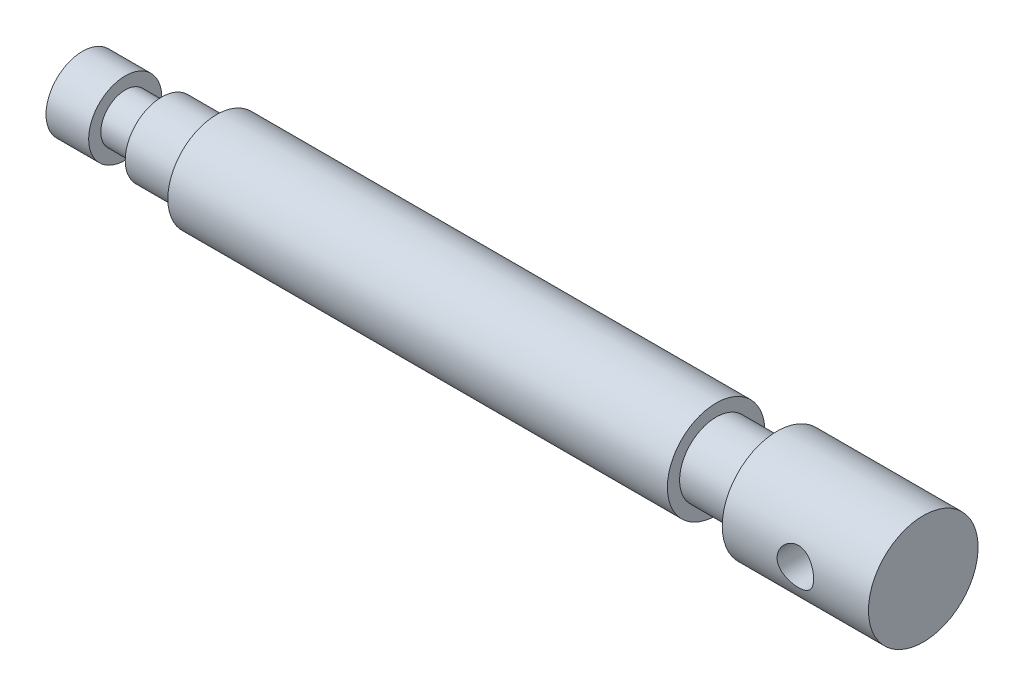
ISO-10303-21;
HEADER;
FILE_DESCRIPTION(('STEP AP214'),'2;1');
FILE_NAME('part.step','',(''),(''),'','','');
FILE_SCHEMA(('AUTOMOTIVE_DESIGN { 1 0 10303 214 1 1 1 1 }'));
ENDSEC;
DATA;
#1=APPLICATION_CONTEXT('core data for automotive mechanical design processes');
#2=APPLICATION_PROTOCOL_DEFINITION('international standard','automotive_design',2000,#1);
#3=PRODUCT_CONTEXT('',#1,'mechanical');
#4=PRODUCT('Part','Part','',(#3));
#5=PRODUCT_RELATED_PRODUCT_CATEGORY('part','',(#4));
#6=PRODUCT_DEFINITION_FORMATION('','',#4);
#7=PRODUCT_DEFINITION_CONTEXT('part definition',#1,'design');
#8=PRODUCT_DEFINITION('design','',#6,#7);
#9=PRODUCT_DEFINITION_SHAPE('','',#8);
#10=(LENGTH_UNIT() NAMED_UNIT(*) SI_UNIT(.MILLI.,.METRE.));
#11=(NAMED_UNIT(*) PLANE_ANGLE_UNIT() SI_UNIT($,.RADIAN.));
#12=(NAMED_UNIT(*) SI_UNIT($,.STERADIAN.) SOLID_ANGLE_UNIT());
#13=UNCERTAINTY_MEASURE_WITH_UNIT(LENGTH_MEASURE(1.E-05),#10,'distance_accuracy_value','');
#14=(GEOMETRIC_REPRESENTATION_CONTEXT(3) GLOBAL_UNCERTAINTY_ASSIGNED_CONTEXT((#13)) GLOBAL_UNIT_ASSIGNED_CONTEXT((#10,
#11,#12)) REPRESENTATION_CONTEXT('',''));
#15=CARTESIAN_POINT('',(0.,0.,0.));
#16=DIRECTION('',(0.,0.,1.));
#17=DIRECTION('',(1.,0.,0.));
#18=AXIS2_PLACEMENT_3D('',#15,#16,#17);
#19=CARTESIAN_POINT('',(138.,0.,0.));
#20=DIRECTION('',(1.,0.,0.));
#21=DIRECTION('',(0.,0.,-1.));
#22=AXIS2_PLACEMENT_3D('',#19,#20,#21);
#23=PLANE('',#22);
#24=CARTESIAN_POINT('',(138.,0.,0.));
#25=DIRECTION('',(-1.,0.,0.));
#26=DIRECTION('',(0.,0.,1.));
#27=AXIS2_PLACEMENT_3D('',#24,#25,#26);
#28=CIRCLE('',#27,9.);
#29=CARTESIAN_POINT('',(138.,0.,9.));
#30=VERTEX_POINT('',#29);
#31=EDGE_CURVE('E10',#30,#30,#28,.T.);
#32=ORIENTED_EDGE('',*,*,#31,.F.);
#33=EDGE_LOOP('',(#32));
#34=FACE_BOUND('',#33,.T.);
#35=ADVANCED_FACE('F39',(#34),#23,.T.);
#36=CARTESIAN_POINT('',(0.,0.,0.));
#37=DIRECTION('',(-1.,0.,0.));
#38=DIRECTION('',(0.,0.,1.));
#39=AXIS2_PLACEMENT_3D('',#36,#37,#38);
#40=CYLINDRICAL_SURFACE('',#39,9.);
#41=CARTESIAN_POINT('',(129.,0.,-9.));
#42=CARTESIAN_POINT('',(129.000000761195,-0.163690088660168,-9.00000045902832));
#43=CARTESIAN_POINT('',(128.986559201618,-0.327375583615647,-8.99549308522634));
#44=CARTESIAN_POINT('',(128.933312673548,-0.649925282618914,-8.97795630609842));
#45=CARTESIAN_POINT('',(128.893504968153,-0.808788984356453,-8.96492601606458));
#46=CARTESIAN_POINT('',(128.789042269848,-1.11699836850533,-8.93175923719328));
#47=CARTESIAN_POINT('',(128.724428812622,-1.26635947765811,-8.9116346319256));
#48=CARTESIAN_POINT('',(128.572376481485,-1.55212481041598,-8.86633337152025));
#49=CARTESIAN_POINT('',(128.484933104992,-1.68852647087612,-8.84115572003334));
#50=CARTESIAN_POINT('',(128.286522585424,-1.94922502506679,-8.78742283329015));
#51=CARTESIAN_POINT('',(128.174906297219,-2.07301110089492,-8.75878669391355));
#52=CARTESIAN_POINT('',(127.93269853588,-2.30049807810625,-8.70180944349364));
#53=CARTESIAN_POINT('',(127.802102895214,-2.40419455646838,-8.67346839871647));
#54=CARTESIAN_POINT('',(127.521044654411,-2.59147482668358,-8.61939997431822));
#55=CARTESIAN_POINT('',(127.370118780804,-2.6743945746631,-8.59377117827064));
#56=CARTESIAN_POINT('',(127.055471716624,-2.81345662163316,-8.54925916255804));
#57=CARTESIAN_POINT('',(126.891754448512,-2.86960709216029,-8.53037388482237));
#58=CARTESIAN_POINT('',(126.56198033551,-2.95162038452748,-8.50233909808132));
#59=CARTESIAN_POINT('',(126.396188374533,-2.9784403448153,-8.49288287308834));
#60=CARTESIAN_POINT('',(126.062208737532,-3.00402337000343,-8.48386969888523));
#61=CARTESIAN_POINT('',(125.894021817872,-3.00279510481415,-8.4843096906819));
#62=CARTESIAN_POINT('',(125.568190108668,-2.97305971111025,-8.49477045024541));
#63=CARTESIAN_POINT('',(125.410414791243,-2.94580173950098,-8.50435247602599));
#64=CARTESIAN_POINT('',(125.101819741179,-2.86681848854824,-8.53129973173653));
#65=CARTESIAN_POINT('',(124.951000843695,-2.8150902797756,-8.54866589352323));
#66=CARTESIAN_POINT('',(124.657761751226,-2.68781717418062,-8.58953733393747));
#67=CARTESIAN_POINT('',(124.515515923591,-2.61190214612178,-8.61313697379352));
#68=CARTESIAN_POINT('',(124.245387275161,-2.43866731890941,-8.6637767572718));
#69=CARTESIAN_POINT('',(124.1175086192,-2.34134133709201,-8.69081789371391));
#70=CARTESIAN_POINT('',(123.872725205518,-2.1220479980467,-8.74701987503223));
#71=CARTESIAN_POINT('',(123.756741916473,-1.99905945022893,-8.77621768064529));
#72=CARTESIAN_POINT('',(123.54680620001,-1.73501870991019,-8.8322081516111));
#73=CARTESIAN_POINT('',(123.452855885507,-1.59396478698244,-8.85900058614202));
#74=CARTESIAN_POINT('',(123.288911099295,-1.2958428391388,-8.90751323813381));
#75=CARTESIAN_POINT('',(123.219163525978,-1.138629829249,-8.92918050024118));
#76=CARTESIAN_POINT('',(123.107390478133,-0.813807250093516,-8.96461701433304));
#77=CARTESIAN_POINT('',(123.06535537373,-0.646201314464853,-8.97838900964638));
#78=CARTESIAN_POINT('',(123.011833001933,-0.313151488587904,-8.99602881214321));
#79=CARTESIAN_POINT('',(122.999100572482,-0.147928799594531,-9.00030005501184));
#80=CARTESIAN_POINT('',(123.000998020795,0.182325209880718,-8.99966708084482));
#81=CARTESIAN_POINT('',(123.01562327994,0.347356557958957,-8.99476441258087));
#82=CARTESIAN_POINT('',(123.070835723208,0.667559598912772,-8.97660074151313));
#83=CARTESIAN_POINT('',(123.110658618148,0.822878420504535,-8.96358596133577));
#84=CARTESIAN_POINT('',(123.2141803334,1.12456787573872,-8.9307554049021));
#85=CARTESIAN_POINT('',(123.277882198403,1.27093736552582,-8.91093876140025));
#86=CARTESIAN_POINT('',(123.429211295522,1.55486488917982,-8.86586793861869));
#87=CARTESIAN_POINT('',(123.51742377985,1.69208987765145,-8.84048444267358));
#88=CARTESIAN_POINT('',(123.71458245004,1.95019449040676,-8.78715761748787));
#89=CARTESIAN_POINT('',(123.823534968095,2.07106910338673,-8.75921350781483));
#90=CARTESIAN_POINT('',(124.06493625302,2.2987575234189,-8.70230543941334));
#91=CARTESIAN_POINT('',(124.198227680781,2.40468290773732,-8.67335283262284));
#92=CARTESIAN_POINT('',(124.481314703433,2.59277256697073,-8.61899919884126));
#93=CARTESIAN_POINT('',(124.631110435902,2.67493664379304,-8.59359820146007));
#94=CARTESIAN_POINT('',(124.94301904587,2.81279079124908,-8.54947175374151));
#95=CARTESIAN_POINT('',(125.105106237506,2.86853439649506,-8.53073282378937));
#96=CARTESIAN_POINT('',(125.437135950132,2.95168400027806,-8.50232496919349));
#97=CARTESIAN_POINT('',(125.607074896213,2.97910276486182,-8.49265195870918));
#98=CARTESIAN_POINT('',(125.940591288123,3.00382884743202,-8.48393576622532));
#99=CARTESIAN_POINT('',(126.10404702086,3.00261077192519,-8.48437200772245));
#100=CARTESIAN_POINT('',(126.428295224766,2.97372688034607,-8.49453809471602));
#101=CARTESIAN_POINT('',(126.589087853865,2.94606263837575,-8.50426738708085));
#102=CARTESIAN_POINT('',(126.900406989007,2.86611543938802,-8.53153572914676));
#103=CARTESIAN_POINT('',(127.051070475014,2.81431003804652,-8.54892294067433));
#104=CARTESIAN_POINT('',(127.341682220815,2.68793809727922,-8.58949196455406));
#105=CARTESIAN_POINT('',(127.481628093564,2.6133665056614,-8.6126750629018));
#106=CARTESIAN_POINT('',(127.753451009769,2.43978207775028,-8.66348487678139));
#107=CARTESIAN_POINT('',(127.884709505695,2.33984472829373,-8.69126134926412));
#108=CARTESIAN_POINT('',(128.129069440153,2.11992864940694,-8.74750068849759));
#109=CARTESIAN_POINT('',(128.242165727064,1.99994425335444,-8.77596374737117));
#110=CARTESIAN_POINT('',(128.451433236868,1.73772467076206,-8.83170091576632));
#111=CARTESIAN_POINT('',(128.546773043253,1.59480454049917,-8.8588854540377));
#112=CARTESIAN_POINT('',(128.711971286552,1.29407207221985,-8.90777973517837));
#113=CARTESIAN_POINT('',(128.781836237766,1.13626355439703,-8.9294908772379));
#114=CARTESIAN_POINT('',(128.891164897466,0.817480941602912,-8.96416545205626));
#115=CARTESIAN_POINT('',(128.93184739879,0.656963273029215,-8.97747637267568));
#116=CARTESIAN_POINT('',(128.986260842031,0.330961248030737,-8.99539221192665));
#117=CARTESIAN_POINT('',(128.99999923049,0.165478276706237,-8.99999953595715));
#118=CARTESIAN_POINT('',(129.,0.,-9.));
#119=B_SPLINE_CURVE_WITH_KNOTS('',3,(#41,#42,#43,#44,#45,#46,#47,#48,#49,#50,#51,#52,#53,#54,
#55,#56,#57,#58,#59,#60,#61,#62,#63,#64,#65,#66,#67,#68,#69,#70,#71,#72,#73,#74,#75,#76,#77,#78,
#79,#80,#81,#82,#83,#84,#85,#86,#87,#88,#89,#90,#91,#92,#93,#94,#95,#96,#97,#98,#99,#100,#101,
#102,#103,#104,#105,#106,#107,#108,#109,#110,#111,#112,#113,#114,#115,#116,#117,#118),
.UNSPECIFIED.,.T.,.F.,(4,2,2,2,2,2,2,2,2,2,2,2,2,2,2,2,2,2,2,2,2,2,2,2,2,2,2,2,2,2,2,2,2,2,2,2,
2,2,4),(0.,0.490461318078029,0.980973555802563,1.47066801861083,1.96045913339731,
2.46554052848266,2.97073299862591,3.49045154470411,4.01001134078499,4.51205777225523,
5.01394901962458,5.49290479653844,5.97191792566448,6.45864513465392,6.94551307674621,
7.457799174341,7.97013437899854,8.48755216951072,9.00479006631624,9.49960749525508,
9.99434139492529,10.4747447393464,10.9552093585231,11.4483119953121,11.9415654246567,
12.4572306864225,12.9729002470499,13.4875204148031,14.0019085411752,14.4898699819277,
14.9778023805413,15.4564676124125,15.9352391452793,16.4349020007541,16.9347063337134,
17.453989825053,17.9731404345737,18.4690967512144,18.9649159811442),.UNSPECIFIED.);
#120=CARTESIAN_POINT('',(129.,0.,-9.));
#121=VERTEX_POINT('',#120);
#122=EDGE_CURVE('E94',#121,#121,#119,.T.);
#123=ORIENTED_EDGE('',*,*,#122,.F.);
#124=EDGE_LOOP('',(#123));
#125=FACE_BOUND('',#124,.T.);
#126=CARTESIAN_POINT('',(129.,0.,9.));
#127=CARTESIAN_POINT('',(129.000000761195,0.163690088660168,9.00000045902832));
#128=CARTESIAN_POINT('',(128.986559201618,0.327375583615647,8.99549308522634));
#129=CARTESIAN_POINT('',(128.933312673548,0.649925282618914,8.97795630609842));
#130=CARTESIAN_POINT('',(128.893504968153,0.808788984356453,8.96492601606458));
#131=CARTESIAN_POINT('',(128.789042269848,1.11699836850533,8.93175923719328));
#132=CARTESIAN_POINT('',(128.724428812622,1.26635947765811,8.9116346319256));
#133=CARTESIAN_POINT('',(128.572376481485,1.55212481041598,8.86633337152025));
#134=CARTESIAN_POINT('',(128.484933104992,1.68852647087612,8.84115572003334));
#135=CARTESIAN_POINT('',(128.286522585424,1.94922502506679,8.78742283329015));
#136=CARTESIAN_POINT('',(128.174906297219,2.07301110089492,8.75878669391355));
#137=CARTESIAN_POINT('',(127.93269853588,2.30049807810625,8.70180944349364));
#138=CARTESIAN_POINT('',(127.802102895214,2.40419455646838,8.67346839871647));
#139=CARTESIAN_POINT('',(127.521044654411,2.59147482668358,8.61939997431822));
#140=CARTESIAN_POINT('',(127.370118780804,2.6743945746631,8.59377117827064));
#141=CARTESIAN_POINT('',(127.055471716624,2.81345662163316,8.54925916255804));
#142=CARTESIAN_POINT('',(126.891754448512,2.86960709216029,8.53037388482237));
#143=CARTESIAN_POINT('',(126.56198033551,2.95162038452748,8.50233909808132));
#144=CARTESIAN_POINT('',(126.396188374533,2.9784403448153,8.49288287308834));
#145=CARTESIAN_POINT('',(126.062208737532,3.00402337000343,8.48386969888523));
#146=CARTESIAN_POINT('',(125.894021817872,3.00279510481415,8.4843096906819));
#147=CARTESIAN_POINT('',(125.568190108668,2.97305971111025,8.49477045024541));
#148=CARTESIAN_POINT('',(125.410414791243,2.94580173950098,8.50435247602599));
#149=CARTESIAN_POINT('',(125.101819741179,2.86681848854824,8.53129973173653));
#150=CARTESIAN_POINT('',(124.951000843695,2.8150902797756,8.54866589352323));
#151=CARTESIAN_POINT('',(124.657761751226,2.68781717418062,8.58953733393747));
#152=CARTESIAN_POINT('',(124.515515923591,2.61190214612178,8.61313697379352));
#153=CARTESIAN_POINT('',(124.245387275161,2.43866731890941,8.6637767572718));
#154=CARTESIAN_POINT('',(124.1175086192,2.34134133709201,8.69081789371391));
#155=CARTESIAN_POINT('',(123.872725205518,2.1220479980467,8.74701987503223));
#156=CARTESIAN_POINT('',(123.756741916473,1.99905945022893,8.77621768064529));
#157=CARTESIAN_POINT('',(123.54680620001,1.73501870991019,8.8322081516111));
#158=CARTESIAN_POINT('',(123.452855885507,1.59396478698244,8.85900058614202));
#159=CARTESIAN_POINT('',(123.288911099295,1.2958428391388,8.90751323813381));
#160=CARTESIAN_POINT('',(123.219163525978,1.138629829249,8.92918050024118));
#161=CARTESIAN_POINT('',(123.107390478133,0.813807250093516,8.96461701433304));
#162=CARTESIAN_POINT('',(123.06535537373,0.646201314464853,8.97838900964638));
#163=CARTESIAN_POINT('',(123.011833001933,0.313151488587904,8.99602881214321));
#164=CARTESIAN_POINT('',(122.999100572482,0.147928799594531,9.00030005501184));
#165=CARTESIAN_POINT('',(123.000998020795,-0.182325209880718,8.99966708084482));
#166=CARTESIAN_POINT('',(123.01562327994,-0.347356557958957,8.99476441258087));
#167=CARTESIAN_POINT('',(123.070835723208,-0.667559598912772,8.97660074151313));
#168=CARTESIAN_POINT('',(123.110658618148,-0.822878420504535,8.96358596133577));
#169=CARTESIAN_POINT('',(123.2141803334,-1.12456787573872,8.9307554049021));
#170=CARTESIAN_POINT('',(123.277882198403,-1.27093736552582,8.91093876140025));
#171=CARTESIAN_POINT('',(123.429211295522,-1.55486488917982,8.86586793861869));
#172=CARTESIAN_POINT('',(123.51742377985,-1.69208987765145,8.84048444267358));
#173=CARTESIAN_POINT('',(123.71458245004,-1.95019449040676,8.78715761748787));
#174=CARTESIAN_POINT('',(123.823534968095,-2.07106910338673,8.75921350781483));
#175=CARTESIAN_POINT('',(124.06493625302,-2.2987575234189,8.70230543941334));
#176=CARTESIAN_POINT('',(124.198227680781,-2.40468290773732,8.67335283262284));
#177=CARTESIAN_POINT('',(124.481314703433,-2.59277256697073,8.61899919884126));
#178=CARTESIAN_POINT('',(124.631110435902,-2.67493664379304,8.59359820146007));
#179=CARTESIAN_POINT('',(124.94301904587,-2.81279079124908,8.54947175374151));
#180=CARTESIAN_POINT('',(125.105106237506,-2.86853439649506,8.53073282378937));
#181=CARTESIAN_POINT('',(125.437135950132,-2.95168400027806,8.50232496919349));
#182=CARTESIAN_POINT('',(125.607074896213,-2.97910276486182,8.49265195870918));
#183=CARTESIAN_POINT('',(125.940591288123,-3.00382884743202,8.48393576622532));
#184=CARTESIAN_POINT('',(126.10404702086,-3.00261077192519,8.48437200772245));
#185=CARTESIAN_POINT('',(126.428295224766,-2.97372688034607,8.49453809471602));
#186=CARTESIAN_POINT('',(126.589087853865,-2.94606263837575,8.50426738708085));
#187=CARTESIAN_POINT('',(126.900406989007,-2.86611543938802,8.53153572914676));
#188=CARTESIAN_POINT('',(127.051070475014,-2.81431003804652,8.54892294067433));
#189=CARTESIAN_POINT('',(127.341682220815,-2.68793809727922,8.58949196455406));
#190=CARTESIAN_POINT('',(127.481628093564,-2.6133665056614,8.6126750629018));
#191=CARTESIAN_POINT('',(127.753451009769,-2.43978207775028,8.66348487678139));
#192=CARTESIAN_POINT('',(127.884709505695,-2.33984472829373,8.69126134926412));
#193=CARTESIAN_POINT('',(128.129069440153,-2.11992864940694,8.74750068849759));
#194=CARTESIAN_POINT('',(128.242165727064,-1.99994425335444,8.77596374737117));
#195=CARTESIAN_POINT('',(128.451433236868,-1.73772467076206,8.83170091576632));
#196=CARTESIAN_POINT('',(128.546773043253,-1.59480454049917,8.8588854540377));
#197=CARTESIAN_POINT('',(128.711971286552,-1.29407207221985,8.90777973517837));
#198=CARTESIAN_POINT('',(128.781836237766,-1.13626355439703,8.9294908772379));
#199=CARTESIAN_POINT('',(128.891164897466,-0.817480941602912,8.96416545205626));
#200=CARTESIAN_POINT('',(128.93184739879,-0.656963273029215,8.97747637267568));
#201=CARTESIAN_POINT('',(128.986260842031,-0.330961248030737,8.99539221192665));
#202=CARTESIAN_POINT('',(128.99999923049,-0.165478276706237,8.99999953595715));
#203=CARTESIAN_POINT('',(129.,0.,9.));
#204=B_SPLINE_CURVE_WITH_KNOTS('',3,(#126,#127,#128,#129,#130,#131,#132,#133,#134,#135,#136,
#137,#138,#139,#140,#141,#142,#143,#144,#145,#146,#147,#148,#149,#150,#151,#152,#153,#154,#155,
#156,#157,#158,#159,#160,#161,#162,#163,#164,#165,#166,#167,#168,#169,#170,#171,#172,#173,#174,
#175,#176,#177,#178,#179,#180,#181,#182,#183,#184,#185,#186,#187,#188,#189,#190,#191,#192,#193,
#194,#195,#196,#197,#198,#199,#200,#201,#202,#203),.UNSPECIFIED.,.T.,.F.,(4,2,2,2,2,2,2,2,2,2,2,
2,2,2,2,2,2,2,2,2,2,2,2,2,2,2,2,2,2,2,2,2,2,2,2,2,2,2,4),(0.,0.490461318078029,
0.980973555802563,1.47066801861083,1.96045913339731,2.46554052848266,2.97073299862591,
3.49045154470411,4.01001134078499,4.51205777225523,5.01394901962458,5.49290479653844,
5.97191792566448,6.45864513465392,6.94551307674621,7.457799174341,7.97013437899854,
8.48755216951072,9.00479006631624,9.49960749525508,9.99434139492529,10.4747447393464,
10.9552093585231,11.4483119953121,11.9415654246567,12.4572306864225,12.9729002470499,
13.4875204148031,14.0019085411752,14.4898699819277,14.9778023805413,15.4564676124125,
15.9352391452793,16.4349020007541,16.9347063337134,17.453989825053,17.9731404345737,
18.4690967512144,18.9649159811442),.UNSPECIFIED.);
#205=CARTESIAN_POINT('',(129.,0.,9.));
#206=VERTEX_POINT('',#205);
#207=EDGE_CURVE('E102',#206,#206,#204,.T.);
#208=ORIENTED_EDGE('',*,*,#207,.F.);
#209=EDGE_LOOP('',(#208));
#210=FACE_BOUND('',#209,.T.);
#211=ORIENTED_EDGE('',*,*,#31,.T.);
#212=EDGE_LOOP('',(#211));
#213=FACE_BOUND('',#212,.T.);
#214=CARTESIAN_POINT('',(114.,0.,0.));
#215=DIRECTION('',(-1.,0.,0.));
#216=DIRECTION('',(0.,0.,1.));
#217=AXIS2_PLACEMENT_3D('',#214,#215,#216);
#218=CIRCLE('',#217,9.);
#219=CARTESIAN_POINT('',(114.,0.,9.));
#220=VERTEX_POINT('',#219);
#221=EDGE_CURVE('E46',#220,#220,#218,.T.);
#222=ORIENTED_EDGE('',*,*,#221,.F.);
#223=EDGE_LOOP('',(#222));
#224=FACE_BOUND('',#223,.T.);
#225=ADVANCED_FACE('F106',(#125,#210,#213,#224),#40,.T.);
#226=CARTESIAN_POINT('',(114.,0.,0.));
#227=DIRECTION('',(-1.,0.,0.));
#228=DIRECTION('',(0.,0.,1.));
#229=AXIS2_PLACEMENT_3D('',#226,#227,#228);
#230=PLANE('',#229);
#231=ORIENTED_EDGE('',*,*,#221,.T.);
#232=EDGE_LOOP('',(#231));
#233=FACE_BOUND('',#232,.T.);
#234=CARTESIAN_POINT('',(114.,0.,0.));
#235=DIRECTION('',(-1.,0.,0.));
#236=DIRECTION('',(0.,0.,1.));
#237=AXIS2_PLACEMENT_3D('',#234,#235,#236);
#238=CIRCLE('',#237,6.);
#239=CARTESIAN_POINT('',(114.,0.,6.));
#240=VERTEX_POINT('',#239);
#241=EDGE_CURVE('E51',#240,#240,#238,.T.);
#242=ORIENTED_EDGE('',*,*,#241,.F.);
#243=EDGE_LOOP('',(#242));
#244=FACE_BOUND('',#243,.T.);
#245=ADVANCED_FACE('F153',(#233,#244),#230,.T.);
#246=CARTESIAN_POINT('',(0.,0.,0.));
#247=DIRECTION('',(-1.,0.,0.));
#248=DIRECTION('',(0.,0.,1.));
#249=AXIS2_PLACEMENT_3D('',#246,#247,#248);
#250=CYLINDRICAL_SURFACE('',#249,6.);
#251=ORIENTED_EDGE('',*,*,#241,.T.);
#252=EDGE_LOOP('',(#251));
#253=FACE_BOUND('',#252,.T.);
#254=CARTESIAN_POINT('',(104.,0.,0.));
#255=DIRECTION('',(-1.,0.,0.));
#256=DIRECTION('',(0.,0.,1.));
#257=AXIS2_PLACEMENT_3D('',#254,#255,#256);
#258=CIRCLE('',#257,6.);
#259=CARTESIAN_POINT('',(104.,0.,6.));
#260=VERTEX_POINT('',#259);
#261=EDGE_CURVE('E56',#260,#260,#258,.T.);
#262=ORIENTED_EDGE('',*,*,#261,.F.);
#263=EDGE_LOOP('',(#262));
#264=FACE_BOUND('',#263,.T.);
#265=ADVANCED_FACE('F150',(#253,#264),#250,.T.);
#266=CARTESIAN_POINT('',(104.,0.,0.));
#267=DIRECTION('',(1.,0.,0.));
#268=DIRECTION('',(0.,0.,-1.));
#269=AXIS2_PLACEMENT_3D('',#266,#267,#268);
#270=PLANE('',#269);
#271=ORIENTED_EDGE('',*,*,#261,.T.);
#272=EDGE_LOOP('',(#271));
#273=FACE_BOUND('',#272,.T.);
#274=CARTESIAN_POINT('',(104.,0.,0.));
#275=DIRECTION('',(-1.,0.,0.));
#276=DIRECTION('',(0.,0.,1.));
#277=AXIS2_PLACEMENT_3D('',#274,#275,#276);
#278=CIRCLE('',#277,8.);
#279=CARTESIAN_POINT('',(104.,0.,8.));
#280=VERTEX_POINT('',#279);
#281=EDGE_CURVE('E62',#280,#280,#278,.T.);
#282=ORIENTED_EDGE('',*,*,#281,.F.);
#283=EDGE_LOOP('',(#282));
#284=FACE_BOUND('',#283,.T.);
#285=ADVANCED_FACE('F146',(#273,#284),#270,.T.);
#286=CARTESIAN_POINT('',(0.,0.,0.));
#287=DIRECTION('',(-1.,0.,0.));
#288=DIRECTION('',(0.,0.,1.));
#289=AXIS2_PLACEMENT_3D('',#286,#287,#288);
#290=CYLINDRICAL_SURFACE('',#289,8.);
#291=ORIENTED_EDGE('',*,*,#281,.T.);
#292=EDGE_LOOP('',(#291));
#293=FACE_BOUND('',#292,.T.);
#294=CARTESIAN_POINT('',(22.,0.,0.));
#295=DIRECTION('',(-1.,0.,0.));
#296=DIRECTION('',(0.,0.,1.));
#297=AXIS2_PLACEMENT_3D('',#294,#295,#296);
#298=CIRCLE('',#297,8.);
#299=CARTESIAN_POINT('',(22.,0.,8.));
#300=VERTEX_POINT('',#299);
#301=EDGE_CURVE('E66',#300,#300,#298,.T.);
#302=ORIENTED_EDGE('',*,*,#301,.F.);
#303=EDGE_LOOP('',(#302));
#304=FACE_BOUND('',#303,.T.);
#305=ADVANCED_FACE('F142',(#293,#304),#290,.T.);
#306=CARTESIAN_POINT('',(22.,0.,0.));
#307=DIRECTION('',(-1.,0.,0.));
#308=DIRECTION('',(0.,0.,1.));
#309=AXIS2_PLACEMENT_3D('',#306,#307,#308);
#310=PLANE('',#309);
#311=ORIENTED_EDGE('',*,*,#301,.T.);
#312=EDGE_LOOP('',(#311));
#313=FACE_BOUND('',#312,.T.);
#314=CARTESIAN_POINT('',(22.,0.,0.));
#315=DIRECTION('',(-1.,0.,0.));
#316=DIRECTION('',(0.,0.,1.));
#317=AXIS2_PLACEMENT_3D('',#314,#315,#316);
#318=CIRCLE('',#317,6.);
#319=CARTESIAN_POINT('',(22.,0.,6.));
#320=VERTEX_POINT('',#319);
#321=EDGE_CURVE('E70',#320,#320,#318,.T.);
#322=ORIENTED_EDGE('',*,*,#321,.F.);
#323=EDGE_LOOP('',(#322));
#324=FACE_BOUND('',#323,.T.);
#325=ADVANCED_FACE('F138',(#313,#324),#310,.T.);
#326=CARTESIAN_POINT('',(0.,0.,0.));
#327=DIRECTION('',(-1.,0.,0.));
#328=DIRECTION('',(0.,0.,1.));
#329=AXIS2_PLACEMENT_3D('',#326,#327,#328);
#330=CYLINDRICAL_SURFACE('',#329,6.);
#331=ORIENTED_EDGE('',*,*,#321,.T.);
#332=EDGE_LOOP('',(#331));
#333=FACE_BOUND('',#332,.T.);
#334=CARTESIAN_POINT('',(13.,0.,0.));
#335=DIRECTION('',(-1.,0.,0.));
#336=DIRECTION('',(0.,0.,1.));
#337=AXIS2_PLACEMENT_3D('',#334,#335,#336);
#338=CIRCLE('',#337,6.);
#339=CARTESIAN_POINT('',(13.,0.,6.));
#340=VERTEX_POINT('',#339);
#341=EDGE_CURVE('E74',#340,#340,#338,.T.);
#342=ORIENTED_EDGE('',*,*,#341,.F.);
#343=EDGE_LOOP('',(#342));
#344=FACE_BOUND('',#343,.T.);
#345=ADVANCED_FACE('F134',(#333,#344),#330,.T.);
#346=CARTESIAN_POINT('',(13.,0.,0.));
#347=DIRECTION('',(-1.,0.,0.));
#348=DIRECTION('',(0.,0.,1.));
#349=AXIS2_PLACEMENT_3D('',#346,#347,#348);
#350=PLANE('',#349);
#351=ORIENTED_EDGE('',*,*,#341,.T.);
#352=EDGE_LOOP('',(#351));
#353=FACE_BOUND('',#352,.T.);
#354=CARTESIAN_POINT('',(13.,0.,0.));
#355=DIRECTION('',(-1.,0.,0.));
#356=DIRECTION('',(0.,0.,1.));
#357=AXIS2_PLACEMENT_3D('',#354,#355,#356);
#358=CIRCLE('',#357,4.);
#359=CARTESIAN_POINT('',(13.,0.,4.));
#360=VERTEX_POINT('',#359);
#361=EDGE_CURVE('E78',#360,#360,#358,.T.);
#362=ORIENTED_EDGE('',*,*,#361,.F.);
#363=EDGE_LOOP('',(#362));
#364=FACE_BOUND('',#363,.T.);
#365=ADVANCED_FACE('F130',(#353,#364),#350,.T.);
#366=CARTESIAN_POINT('',(0.,0.,0.));
#367=DIRECTION('',(-1.,0.,0.));
#368=DIRECTION('',(0.,0.,1.));
#369=AXIS2_PLACEMENT_3D('',#366,#367,#368);
#370=CYLINDRICAL_SURFACE('',#369,4.);
#371=ORIENTED_EDGE('',*,*,#361,.T.);
#372=EDGE_LOOP('',(#371));
#373=FACE_BOUND('',#372,.T.);
#374=CARTESIAN_POINT('',(7.,0.,0.));
#375=DIRECTION('',(-1.,0.,0.));
#376=DIRECTION('',(0.,0.,1.));
#377=AXIS2_PLACEMENT_3D('',#374,#375,#376);
#378=CIRCLE('',#377,4.);
#379=CARTESIAN_POINT('',(7.,0.,4.));
#380=VERTEX_POINT('',#379);
#381=EDGE_CURVE('E82',#380,#380,#378,.T.);
#382=ORIENTED_EDGE('',*,*,#381,.F.);
#383=EDGE_LOOP('',(#382));
#384=FACE_BOUND('',#383,.T.);
#385=ADVANCED_FACE('F126',(#373,#384),#370,.T.);
#386=CARTESIAN_POINT('',(7.,0.,0.));
#387=DIRECTION('',(1.,0.,0.));
#388=DIRECTION('',(0.,0.,-1.));
#389=AXIS2_PLACEMENT_3D('',#386,#387,#388);
#390=PLANE('',#389);
#391=ORIENTED_EDGE('',*,*,#381,.T.);
#392=EDGE_LOOP('',(#391));
#393=FACE_BOUND('',#392,.T.);
#394=CARTESIAN_POINT('',(7.,0.,0.));
#395=DIRECTION('',(-1.,0.,0.));
#396=DIRECTION('',(0.,0.,1.));
#397=AXIS2_PLACEMENT_3D('',#394,#395,#396);
#398=CIRCLE('',#397,6.);
#399=CARTESIAN_POINT('',(7.,0.,6.));
#400=VERTEX_POINT('',#399);
#401=EDGE_CURVE('E86',#400,#400,#398,.T.);
#402=ORIENTED_EDGE('',*,*,#401,.F.);
#403=EDGE_LOOP('',(#402));
#404=FACE_BOUND('',#403,.T.);
#405=ADVANCED_FACE('F122',(#393,#404),#390,.T.);
#406=CARTESIAN_POINT('',(0.,0.,0.));
#407=DIRECTION('',(-1.,0.,0.));
#408=DIRECTION('',(0.,0.,1.));
#409=AXIS2_PLACEMENT_3D('',#406,#407,#408);
#410=CYLINDRICAL_SURFACE('',#409,6.);
#411=ORIENTED_EDGE('',*,*,#401,.T.);
#412=EDGE_LOOP('',(#411));
#413=FACE_BOUND('',#412,.T.);
#414=CARTESIAN_POINT('',(0.,0.,0.));
#415=DIRECTION('',(-1.,0.,0.));
#416=DIRECTION('',(0.,0.,1.));
#417=AXIS2_PLACEMENT_3D('',#414,#415,#416);
#418=CIRCLE('',#417,6.);
#419=CARTESIAN_POINT('',(0.,0.,6.));
#420=VERTEX_POINT('',#419);
#421=EDGE_CURVE('E90',#420,#420,#418,.T.);
#422=ORIENTED_EDGE('',*,*,#421,.F.);
#423=EDGE_LOOP('',(#422));
#424=FACE_BOUND('',#423,.T.);
#425=ADVANCED_FACE('F118',(#413,#424),#410,.T.);
#426=CARTESIAN_POINT('',(0.,0.,0.));
#427=DIRECTION('',(-1.,0.,0.));
#428=DIRECTION('',(0.,0.,1.));
#429=AXIS2_PLACEMENT_3D('',#426,#427,#428);
#430=PLANE('',#429);
#431=ORIENTED_EDGE('',*,*,#421,.T.);
#432=EDGE_LOOP('',(#431));
#433=FACE_BOUND('',#432,.T.);
#434=ADVANCED_FACE('F113',(#433),#430,.T.);
#435=CARTESIAN_POINT('',(126.,0.,-9.));
#436=DIRECTION('',(0.,0.,1.));
#437=DIRECTION('',(1.,0.,0.));
#438=AXIS2_PLACEMENT_3D('',#435,#436,#437);
#439=CYLINDRICAL_SURFACE('',#438,2.99999999999999);
#440=ORIENTED_EDGE('',*,*,#207,.T.);
#441=EDGE_LOOP('',(#440));
#442=FACE_BOUND('',#441,.T.);
#443=ORIENTED_EDGE('',*,*,#122,.T.);
#444=EDGE_LOOP('',(#443));
#445=FACE_BOUND('',#444,.T.);
#446=ADVANCED_FACE('F109',(#442,#445),#439,.F.);
#447=CLOSED_SHELL('',(#35,#225,#245,#265,#285,#305,#325,#345,#365,#385,#405,#425,#434,#446));
#448=MANIFOLD_SOLID_BREP('B2',#447);
#449=ADVANCED_BREP_SHAPE_REPRESENTATION('',(#18,#448),#14);
#450=SHAPE_DEFINITION_REPRESENTATION(#9,#449);
ENDSEC;
END-ISO-10303-21;
